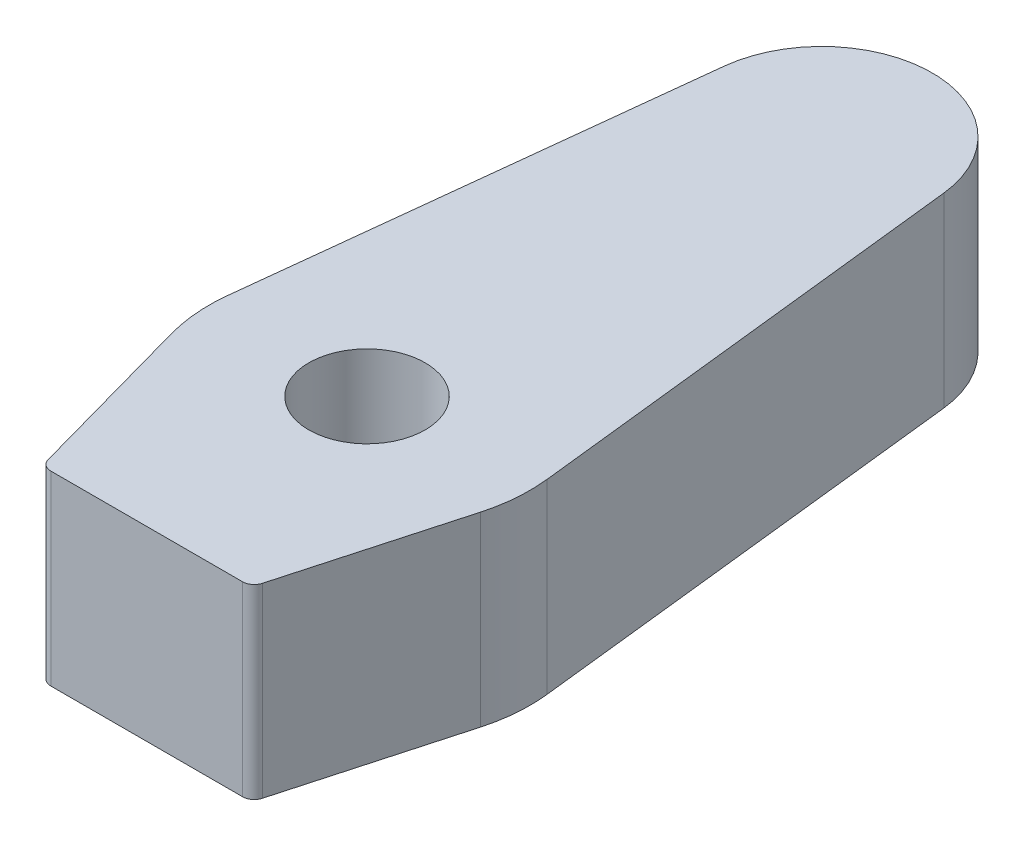
ISO-10303-21;
HEADER;
FILE_DESCRIPTION(('STEP AP214'),'2;1');
FILE_NAME('part.step','',(''),(''),'','','');
FILE_SCHEMA(('AUTOMOTIVE_DESIGN { 1 0 10303 214 1 1 1 1 }'));
ENDSEC;
DATA;
#1=APPLICATION_CONTEXT('core data for automotive mechanical design processes');
#2=APPLICATION_PROTOCOL_DEFINITION('international standard','automotive_design',2000,#1);
#3=PRODUCT_CONTEXT('',#1,'mechanical');
#4=PRODUCT('Part','Part','',(#3));
#5=PRODUCT_RELATED_PRODUCT_CATEGORY('part','',(#4));
#6=PRODUCT_DEFINITION_FORMATION('','',#4);
#7=PRODUCT_DEFINITION_CONTEXT('part definition',#1,'design');
#8=PRODUCT_DEFINITION('design','',#6,#7);
#9=PRODUCT_DEFINITION_SHAPE('','',#8);
#10=(LENGTH_UNIT() NAMED_UNIT(*) SI_UNIT(.MILLI.,.METRE.));
#11=(NAMED_UNIT(*) PLANE_ANGLE_UNIT() SI_UNIT($,.RADIAN.));
#12=(NAMED_UNIT(*) SI_UNIT($,.STERADIAN.) SOLID_ANGLE_UNIT());
#13=UNCERTAINTY_MEASURE_WITH_UNIT(LENGTH_MEASURE(1.E-05),#10,'distance_accuracy_value','');
#14=(GEOMETRIC_REPRESENTATION_CONTEXT(3) GLOBAL_UNCERTAINTY_ASSIGNED_CONTEXT((#13)) GLOBAL_UNIT_ASSIGNED_CONTEXT((#10,
#11,#12)) REPRESENTATION_CONTEXT('',''));
#15=CARTESIAN_POINT('',(0.,0.,0.));
#16=DIRECTION('',(0.,0.,1.));
#17=DIRECTION('',(1.,0.,0.));
#18=AXIS2_PLACEMENT_3D('',#15,#16,#17);
#19=CARTESIAN_POINT('',(0.,8.,-14.5));
#20=DIRECTION('',(0.,-1.,0.));
#21=DIRECTION('',(0.,0.,-1.));
#22=AXIS2_PLACEMENT_3D('',#19,#20,#21);
#23=CYLINDRICAL_SURFACE('',#22,4.75);
#24=CARTESIAN_POINT('',(0.,0.,-14.5));
#25=DIRECTION('',(0.,1.,0.));
#26=DIRECTION('',(0.,0.,1.));
#27=AXIS2_PLACEMENT_3D('',#24,#25,#26);
#28=CIRCLE('',#27,4.75);
#29=CARTESIAN_POINT('',(4.72098441721273,0.,-15.0242195460245));
#30=VERTEX_POINT('',#29);
#31=CARTESIAN_POINT('',(-4.72098441721284,0.,-15.0242195460245));
#32=VERTEX_POINT('',#31);
#33=EDGE_CURVE('E142',#30,#32,#28,.T.);
#34=ORIENTED_EDGE('',*,*,#33,.T.);
#35=DIRECTION('',(0.,-1.,0.));
#36=VECTOR('',#35,1.);
#37=CARTESIAN_POINT('',(-4.72098441721284,8.,-15.0242195460245));
#38=LINE('',#37,#36);
#39=CARTESIAN_POINT('',(-4.72098441721284,8.,-15.0242195460245));
#40=VERTEX_POINT('',#39);
#41=EDGE_CURVE('E11',#40,#32,#38,.T.);
#42=ORIENTED_EDGE('',*,*,#41,.F.);
#43=CARTESIAN_POINT('',(0.,8.,-14.5));
#44=DIRECTION('',(0.,1.,0.));
#45=DIRECTION('',(0.,0.,1.));
#46=AXIS2_PLACEMENT_3D('',#43,#44,#45);
#47=CIRCLE('',#46,4.75);
#48=CARTESIAN_POINT('',(4.72098441721273,8.,-15.0242195460245));
#49=VERTEX_POINT('',#48);
#50=EDGE_CURVE('E166',#49,#40,#47,.T.);
#51=ORIENTED_EDGE('',*,*,#50,.F.);
#52=DIRECTION('',(0.,-1.,0.));
#53=VECTOR('',#52,1.);
#54=CARTESIAN_POINT('',(4.72098441721273,8.,-15.0242195460245));
#55=LINE('',#54,#53);
#56=EDGE_CURVE('E49',#49,#30,#55,.T.);
#57=ORIENTED_EDGE('',*,*,#56,.T.);
#58=EDGE_LOOP('',(#34,#42,#51,#57));
#59=FACE_BOUND('',#58,.T.);
#60=ADVANCED_FACE('F33',(#59),#23,.T.);
#61=CARTESIAN_POINT('',(-4.72098441721284,8.,-15.0242195460245));
#62=DIRECTION('',(0.993891456255323,0.,0.110362009689359));
#63=DIRECTION('',(0.110362009689359,0.,-0.993891456255323));
#64=AXIS2_PLACEMENT_3D('',#61,#62,#63);
#65=PLANE('',#64);
#66=DIRECTION('',(-0.110362009689359,0.,0.993891456255323));
#67=VECTOR('',#66,1.);
#68=CARTESIAN_POINT('',(-4.72098441721284,0.,-15.0242195460245));
#69=LINE('',#68,#67);
#70=CARTESIAN_POINT('',(-6.85081178204851,0.,4.15644984525669));
#71=VERTEX_POINT('',#70);
#72=EDGE_CURVE('E144',#32,#71,#69,.T.);
#73=ORIENTED_EDGE('',*,*,#72,.T.);
#74=DIRECTION('',(0.,-1.,0.));
#75=VECTOR('',#74,1.);
#76=CARTESIAN_POINT('',(-6.85081178204851,8.,4.15644984525669));
#77=LINE('',#76,#75);
#78=CARTESIAN_POINT('',(-6.85081178204851,8.,4.15644984525669));
#79=VERTEX_POINT('',#78);
#80=EDGE_CURVE('E41',#79,#71,#77,.T.);
#81=ORIENTED_EDGE('',*,*,#80,.F.);
#82=DIRECTION('',(-0.110362009689359,0.,0.993891456255323));
#83=VECTOR('',#82,1.);
#84=CARTESIAN_POINT('',(-4.72098441721284,8.,-15.0242195460245));
#85=LINE('',#84,#83);
#86=EDGE_CURVE('E94',#40,#79,#85,.T.);
#87=ORIENTED_EDGE('',*,*,#86,.F.);
#88=ORIENTED_EDGE('',*,*,#41,.T.);
#89=EDGE_LOOP('',(#73,#81,#87,#88));
#90=FACE_BOUND('',#89,.T.);
#91=ADVANCED_FACE('F224',(#90),#65,.F.);
#92=CARTESIAN_POINT('',(0.106428411738743,8.,4.92898391308223));
#93=DIRECTION('',(0.,-1.,0.));
#94=DIRECTION('',(0.,0.,-1.));
#95=AXIS2_PLACEMENT_3D('',#92,#93,#94);
#96=CYLINDRICAL_SURFACE('',#95,7.);
#97=CARTESIAN_POINT('',(0.106428411738743,0.,4.92898391308223));
#98=DIRECTION('',(0.,1.,0.));
#99=DIRECTION('',(0.,0.,1.));
#100=AXIS2_PLACEMENT_3D('',#97,#98,#99);
#101=CIRCLE('',#100,7.);
#102=CARTESIAN_POINT('',(-6.63819695567083,0.,6.80249095958494));
#103=VERTEX_POINT('',#102);
#104=EDGE_CURVE('E147',#71,#103,#101,.T.);
#105=ORIENTED_EDGE('',*,*,#104,.T.);
#106=DIRECTION('',(0.,-1.,0.));
#107=VECTOR('',#106,1.);
#108=CARTESIAN_POINT('',(-6.63819695567083,8.,6.80249095958494));
#109=LINE('',#108,#107);
#110=CARTESIAN_POINT('',(-6.63819695567083,8.,6.80249095958494));
#111=VERTEX_POINT('',#110);
#112=EDGE_CURVE('E177',#111,#103,#109,.T.);
#113=ORIENTED_EDGE('',*,*,#112,.F.);
#114=CARTESIAN_POINT('',(0.106428411738743,8.,4.92898391308223));
#115=DIRECTION('',(0.,1.,0.));
#116=DIRECTION('',(0.,0.,1.));
#117=AXIS2_PLACEMENT_3D('',#114,#115,#116);
#118=CIRCLE('',#117,7.);
#119=EDGE_CURVE('E184',#79,#111,#118,.T.);
#120=ORIENTED_EDGE('',*,*,#119,.F.);
#121=ORIENTED_EDGE('',*,*,#80,.T.);
#122=EDGE_LOOP('',(#105,#113,#120,#121));
#123=FACE_BOUND('',#122,.T.);
#124=ADVANCED_FACE('F182',(#123),#96,.T.);
#125=CARTESIAN_POINT('',(-4.60171613002966,8.,14.133821931893));
#126=DIRECTION('',(-0.96351790962994,0.,0.267643863786098));
#127=DIRECTION('',(0.267643863786098,0.,0.96351790962994));
#128=AXIS2_PLACEMENT_3D('',#125,#126,#127);
#129=PLANE('',#128);
#130=DIRECTION('',(-0.267643863786098,0.,-0.96351790962994));
#131=VECTOR('',#130,1.);
#132=CARTESIAN_POINT('',(-4.60171613002966,0.,14.133821931893));
#133=LINE('',#132,#131);
#134=CARTESIAN_POINT('',(-4.60171613002966,0.,14.133821931893));
#135=VERTEX_POINT('',#134);
#136=EDGE_CURVE('E150',#135,#103,#133,.T.);
#137=ORIENTED_EDGE('',*,*,#136,.F.);
#138=DIRECTION('',(0.,-1.,0.));
#139=VECTOR('',#138,1.);
#140=CARTESIAN_POINT('',(-4.60171613002966,8.,14.133821931893));
#141=LINE('',#140,#139);
#142=CARTESIAN_POINT('',(-4.60171613002966,8.,14.133821931893));
#143=VERTEX_POINT('',#142);
#144=EDGE_CURVE('E175',#143,#135,#141,.T.);
#145=ORIENTED_EDGE('',*,*,#144,.F.);
#146=DIRECTION('',(-0.267643863786098,0.,-0.96351790962994));
#147=VECTOR('',#146,1.);
#148=CARTESIAN_POINT('',(-4.60171613002966,8.,14.133821931893));
#149=LINE('',#148,#147);
#150=EDGE_CURVE('E194',#143,#111,#149,.T.);
#151=ORIENTED_EDGE('',*,*,#150,.T.);
#152=ORIENTED_EDGE('',*,*,#112,.T.);
#153=EDGE_LOOP('',(#137,#145,#151,#152));
#154=FACE_BOUND('',#153,.T.);
#155=ADVANCED_FACE('F191',(#154),#129,.T.);
#156=CARTESIAN_POINT('',(-4.11995717521469,8.,14.));
#157=DIRECTION('',(0.,-1.,0.));
#158=DIRECTION('',(0.,0.,-1.));
#159=AXIS2_PLACEMENT_3D('',#156,#157,#158);
#160=CYLINDRICAL_SURFACE('',#159,0.5);
#161=CARTESIAN_POINT('',(-4.11995717521469,0.,14.));
#162=DIRECTION('',(0.,-1.,0.));
#163=DIRECTION('',(0.,0.,-1.));
#164=AXIS2_PLACEMENT_3D('',#161,#162,#163);
#165=CIRCLE('',#164,0.5);
#166=CARTESIAN_POINT('',(-4.11995717521469,0.,14.5));
#167=VERTEX_POINT('',#166);
#168=EDGE_CURVE('E153',#167,#135,#165,.T.);
#169=ORIENTED_EDGE('',*,*,#168,.F.);
#170=DIRECTION('',(0.,-1.,0.));
#171=VECTOR('',#170,1.);
#172=CARTESIAN_POINT('',(-4.11995717521469,8.,14.5));
#173=LINE('',#172,#171);
#174=CARTESIAN_POINT('',(-4.11995717521469,8.,14.5));
#175=VERTEX_POINT('',#174);
#176=EDGE_CURVE('E173',#175,#167,#173,.T.);
#177=ORIENTED_EDGE('',*,*,#176,.F.);
#178=CARTESIAN_POINT('',(-4.11995717521469,8.,14.));
#179=DIRECTION('',(0.,-1.,0.));
#180=DIRECTION('',(0.,0.,-1.));
#181=AXIS2_PLACEMENT_3D('',#178,#179,#180);
#182=CIRCLE('',#181,0.5);
#183=EDGE_CURVE('E197',#175,#143,#182,.T.);
#184=ORIENTED_EDGE('',*,*,#183,.T.);
#185=ORIENTED_EDGE('',*,*,#144,.T.);
#186=EDGE_LOOP('',(#169,#177,#184,#185));
#187=FACE_BOUND('',#186,.T.);
#188=ADVANCED_FACE('F299',(#187),#160,.T.);
#189=CARTESIAN_POINT('',(-4.11995717521469,8.,14.5));
#190=DIRECTION('',(0.,0.,-1.));
#191=DIRECTION('',(-1.,0.,0.));
#192=AXIS2_PLACEMENT_3D('',#189,#190,#191);
#193=PLANE('',#192);
#194=DIRECTION('',(1.,0.,0.));
#195=VECTOR('',#194,1.);
#196=CARTESIAN_POINT('',(-4.11995717521469,0.,14.5));
#197=LINE('',#196,#195);
#198=CARTESIAN_POINT('',(4.11995717521478,0.,14.5));
#199=VERTEX_POINT('',#198);
#200=EDGE_CURVE('E156',#167,#199,#197,.T.);
#201=ORIENTED_EDGE('',*,*,#200,.T.);
#202=DIRECTION('',(0.,-1.,0.));
#203=VECTOR('',#202,1.);
#204=CARTESIAN_POINT('',(4.11995717521478,8.,14.5));
#205=LINE('',#204,#203);
#206=CARTESIAN_POINT('',(4.11995717521478,8.,14.5));
#207=VERTEX_POINT('',#206);
#208=EDGE_CURVE('E170',#207,#199,#205,.T.);
#209=ORIENTED_EDGE('',*,*,#208,.F.);
#210=DIRECTION('',(1.,0.,0.));
#211=VECTOR('',#210,1.);
#212=CARTESIAN_POINT('',(-4.11995717521469,8.,14.5));
#213=LINE('',#212,#211);
#214=EDGE_CURVE('E199',#175,#207,#213,.T.);
#215=ORIENTED_EDGE('',*,*,#214,.F.);
#216=ORIENTED_EDGE('',*,*,#176,.T.);
#217=EDGE_LOOP('',(#201,#209,#215,#216));
#218=FACE_BOUND('',#217,.T.);
#219=ADVANCED_FACE('F207',(#218),#193,.F.);
#220=CARTESIAN_POINT('',(4.11995717521479,8.,14.));
#221=DIRECTION('',(0.,-1.,0.));
#222=DIRECTION('',(0.,0.,-1.));
#223=AXIS2_PLACEMENT_3D('',#220,#221,#222);
#224=CYLINDRICAL_SURFACE('',#223,0.5);
#225=CARTESIAN_POINT('',(4.11995717521479,0.,14.));
#226=DIRECTION('',(0.,1.,0.));
#227=DIRECTION('',(0.,0.,1.));
#228=AXIS2_PLACEMENT_3D('',#225,#226,#227);
#229=CIRCLE('',#228,0.5);
#230=CARTESIAN_POINT('',(4.60171613002976,0.,14.133821931893));
#231=VERTEX_POINT('',#230);
#232=EDGE_CURVE('E158',#199,#231,#229,.T.);
#233=ORIENTED_EDGE('',*,*,#232,.T.);
#234=DIRECTION('',(0.,-1.,0.));
#235=VECTOR('',#234,1.);
#236=CARTESIAN_POINT('',(4.60171613002976,8.,14.133821931893));
#237=LINE('',#236,#235);
#238=CARTESIAN_POINT('',(4.60171613002976,8.,14.133821931893));
#239=VERTEX_POINT('',#238);
#240=EDGE_CURVE('E134',#239,#231,#237,.T.);
#241=ORIENTED_EDGE('',*,*,#240,.F.);
#242=CARTESIAN_POINT('',(4.11995717521479,8.,14.));
#243=DIRECTION('',(0.,1.,0.));
#244=DIRECTION('',(0.,0.,1.));
#245=AXIS2_PLACEMENT_3D('',#242,#243,#244);
#246=CIRCLE('',#245,0.5);
#247=EDGE_CURVE('E122',#207,#239,#246,.T.);
#248=ORIENTED_EDGE('',*,*,#247,.F.);
#249=ORIENTED_EDGE('',*,*,#208,.T.);
#250=EDGE_LOOP('',(#233,#241,#248,#249));
#251=FACE_BOUND('',#250,.T.);
#252=ADVANCED_FACE('F210',(#251),#224,.T.);
#253=CARTESIAN_POINT('',(4.60171613002976,8.,14.133821931893));
#254=DIRECTION('',(-0.963517909629941,0.,-0.267643863786092));
#255=DIRECTION('',(-0.267643863786092,0.,0.963517909629942));
#256=AXIS2_PLACEMENT_3D('',#253,#254,#255);
#257=PLANE('',#256);
#258=DIRECTION('',(0.267643863786092,0.,-0.963517909629942));
#259=VECTOR('',#258,1.);
#260=CARTESIAN_POINT('',(4.60171613002976,0.,14.133821931893));
#261=LINE('',#260,#259);
#262=CARTESIAN_POINT('',(6.63819695567087,0.,6.80249095958494));
#263=VERTEX_POINT('',#262);
#264=EDGE_CURVE('E131',#231,#263,#261,.T.);
#265=ORIENTED_EDGE('',*,*,#264,.T.);
#266=DIRECTION('',(0.,-1.,0.));
#267=VECTOR('',#266,1.);
#268=CARTESIAN_POINT('',(6.63819695567087,8.,6.80249095958494));
#269=LINE('',#268,#267);
#270=CARTESIAN_POINT('',(6.63819695567087,8.,6.80249095958494));
#271=VERTEX_POINT('',#270);
#272=EDGE_CURVE('E128',#271,#263,#269,.T.);
#273=ORIENTED_EDGE('',*,*,#272,.F.);
#274=DIRECTION('',(0.267643863786092,0.,-0.963517909629942));
#275=VECTOR('',#274,1.);
#276=CARTESIAN_POINT('',(4.60171613002976,8.,14.133821931893));
#277=LINE('',#276,#275);
#278=EDGE_CURVE('E115',#239,#271,#277,.T.);
#279=ORIENTED_EDGE('',*,*,#278,.F.);
#280=ORIENTED_EDGE('',*,*,#240,.T.);
#281=EDGE_LOOP('',(#265,#273,#279,#280));
#282=FACE_BOUND('',#281,.T.);
#283=ADVANCED_FACE('F129',(#282),#257,.F.);
#284=CARTESIAN_POINT('',(-0.106428411738709,8.,4.92898391308228));
#285=DIRECTION('',(0.,-1.,0.));
#286=DIRECTION('',(0.,0.,-1.));
#287=AXIS2_PLACEMENT_3D('',#284,#285,#286);
#288=CYLINDRICAL_SURFACE('',#287,7.);
#289=CARTESIAN_POINT('',(-0.106428411738709,0.,4.92898391308228));
#290=DIRECTION('',(0.,1.,0.));
#291=DIRECTION('',(0.,0.,1.));
#292=AXIS2_PLACEMENT_3D('',#289,#290,#291);
#293=CIRCLE('',#292,7.);
#294=CARTESIAN_POINT('',(6.85081178204854,0.,4.15644984525669));
#295=VERTEX_POINT('',#294);
#296=EDGE_CURVE('E161',#263,#295,#293,.T.);
#297=ORIENTED_EDGE('',*,*,#296,.T.);
#298=DIRECTION('',(0.,-1.,0.));
#299=VECTOR('',#298,1.);
#300=CARTESIAN_POINT('',(6.85081178204854,8.,4.15644984525669));
#301=LINE('',#300,#299);
#302=CARTESIAN_POINT('',(6.85081178204854,8.,4.15644984525669));
#303=VERTEX_POINT('',#302);
#304=EDGE_CURVE('E82',#303,#295,#301,.T.);
#305=ORIENTED_EDGE('',*,*,#304,.F.);
#306=CARTESIAN_POINT('',(-0.106428411738709,8.,4.92898391308228));
#307=DIRECTION('',(0.,1.,0.));
#308=DIRECTION('',(0.,0.,1.));
#309=AXIS2_PLACEMENT_3D('',#306,#307,#308);
#310=CIRCLE('',#309,7.);
#311=EDGE_CURVE('E120',#271,#303,#310,.T.);
#312=ORIENTED_EDGE('',*,*,#311,.F.);
#313=ORIENTED_EDGE('',*,*,#272,.T.);
#314=EDGE_LOOP('',(#297,#305,#312,#313));
#315=FACE_BOUND('',#314,.T.);
#316=ADVANCED_FACE('F136',(#315),#288,.T.);
#317=CARTESIAN_POINT('',(4.72098441721273,8.,-15.0242195460245));
#318=DIRECTION('',(0.993891456255322,0.,-0.110362009689366));
#319=DIRECTION('',(-0.110362009689366,0.,-0.993891456255322));
#320=AXIS2_PLACEMENT_3D('',#317,#318,#319);
#321=PLANE('',#320);
#322=DIRECTION('',(0.110362009689366,0.,0.993891456255322));
#323=VECTOR('',#322,1.);
#324=CARTESIAN_POINT('',(4.72098441721273,0.,-15.0242195460245));
#325=LINE('',#324,#323);
#326=EDGE_CURVE('E163',#30,#295,#325,.T.);
#327=ORIENTED_EDGE('',*,*,#326,.F.);
#328=ORIENTED_EDGE('',*,*,#56,.F.);
#329=DIRECTION('',(0.110362009689366,0.,0.993891456255322));
#330=VECTOR('',#329,1.);
#331=CARTESIAN_POINT('',(4.72098441721273,8.,-15.0242195460245));
#332=LINE('',#331,#330);
#333=EDGE_CURVE('E137',#49,#303,#332,.T.);
#334=ORIENTED_EDGE('',*,*,#333,.T.);
#335=ORIENTED_EDGE('',*,*,#304,.T.);
#336=EDGE_LOOP('',(#327,#328,#334,#335));
#337=FACE_BOUND('',#336,.T.);
#338=ADVANCED_FACE('F211',(#337),#321,.T.);
#339=CARTESIAN_POINT('',(0.,8.,-14.5));
#340=DIRECTION('',(0.,1.,0.));
#341=DIRECTION('',(0.,0.,1.));
#342=AXIS2_PLACEMENT_3D('',#339,#340,#341);
#343=PLANE('',#342);
#344=CARTESIAN_POINT('',(-0.106428411738709,8.,4.92898391308228));
#345=DIRECTION('',(0.,1.,0.));
#346=DIRECTION('',(0.,0.,1.));
#347=AXIS2_PLACEMENT_3D('',#344,#345,#346);
#348=CIRCLE('',#347,2.5);
#349=CARTESIAN_POINT('',(-0.106428411738709,8.,7.42898391308228));
#350=VERTEX_POINT('',#349);
#351=EDGE_CURVE('E231',#350,#350,#348,.T.);
#352=ORIENTED_EDGE('',*,*,#351,.F.);
#353=EDGE_LOOP('',(#352));
#354=FACE_BOUND('',#353,.T.);
#355=ORIENTED_EDGE('',*,*,#50,.T.);
#356=ORIENTED_EDGE('',*,*,#86,.T.);
#357=ORIENTED_EDGE('',*,*,#119,.T.);
#358=ORIENTED_EDGE('',*,*,#150,.F.);
#359=ORIENTED_EDGE('',*,*,#183,.F.);
#360=ORIENTED_EDGE('',*,*,#214,.T.);
#361=ORIENTED_EDGE('',*,*,#247,.T.);
#362=ORIENTED_EDGE('',*,*,#278,.T.);
#363=ORIENTED_EDGE('',*,*,#311,.T.);
#364=ORIENTED_EDGE('',*,*,#333,.F.);
#365=EDGE_LOOP('',(#355,#356,#357,#358,#359,#360,#361,#362,#363,#364));
#366=FACE_BOUND('',#365,.T.);
#367=ADVANCED_FACE('F117',(#354,#366),#343,.T.);
#368=CARTESIAN_POINT('',(0.,0.,-14.5));
#369=DIRECTION('',(0.,1.,0.));
#370=DIRECTION('',(0.,0.,1.));
#371=AXIS2_PLACEMENT_3D('',#368,#369,#370);
#372=PLANE('',#371);
#373=ORIENTED_EDGE('',*,*,#33,.F.);
#374=ORIENTED_EDGE('',*,*,#326,.T.);
#375=ORIENTED_EDGE('',*,*,#296,.F.);
#376=ORIENTED_EDGE('',*,*,#264,.F.);
#377=ORIENTED_EDGE('',*,*,#232,.F.);
#378=ORIENTED_EDGE('',*,*,#200,.F.);
#379=ORIENTED_EDGE('',*,*,#168,.T.);
#380=ORIENTED_EDGE('',*,*,#136,.T.);
#381=ORIENTED_EDGE('',*,*,#104,.F.);
#382=ORIENTED_EDGE('',*,*,#72,.F.);
#383=EDGE_LOOP('',(#373,#374,#375,#376,#377,#378,#379,#380,#381,#382));
#384=FACE_BOUND('',#383,.T.);
#385=ADVANCED_FACE('F186',(#384),#372,.F.);
#386=CARTESIAN_POINT('',(-0.106428411738709,2.85,4.92898391308228));
#387=DIRECTION('',(0.,1.,0.));
#388=DIRECTION('',(0.,0.,1.));
#389=AXIS2_PLACEMENT_3D('',#386,#387,#388);
#390=CYLINDRICAL_SURFACE('',#389,2.5);
#391=CARTESIAN_POINT('',(-0.106428411738709,2.85,4.92898391308228));
#392=DIRECTION('',(0.,1.,0.));
#393=DIRECTION('',(0.,0.,1.));
#394=AXIS2_PLACEMENT_3D('',#391,#392,#393);
#395=CIRCLE('',#394,2.5);
#396=CARTESIAN_POINT('',(-0.106428411738709,2.85,7.42898391308228));
#397=VERTEX_POINT('',#396);
#398=EDGE_CURVE('E145',#397,#397,#395,.T.);
#399=CARTESIAN_POINT('',(-0.106428411738709,2.85,7.42898391308228));
#400=CARTESIAN_POINT('',(-0.106428411738709,2.90364583333333,7.42898391308228));
#401=CARTESIAN_POINT('',(-0.106428411738709,2.95729166666667,7.42898391308228));
#402=CARTESIAN_POINT('',(-0.106428411738709,3.06458333333333,7.42898391308228));
#403=CARTESIAN_POINT('',(-0.106428411738709,3.11822916666667,7.42898391308228));
#404=CARTESIAN_POINT('',(-0.106428411738709,3.22552083333333,7.42898391308228));
#405=CARTESIAN_POINT('',(-0.106428411738709,3.27916666666667,7.42898391308228));
#406=CARTESIAN_POINT('',(-0.106428411738709,3.38645833333333,7.42898391308228));
#407=CARTESIAN_POINT('',(-0.106428411738709,3.44010416666667,7.42898391308228));
#408=CARTESIAN_POINT('',(-0.106428411738709,3.54739583333333,7.42898391308228));
#409=CARTESIAN_POINT('',(-0.106428411738709,3.60104166666667,7.42898391308228));
#410=CARTESIAN_POINT('',(-0.106428411738709,3.70833333333333,7.42898391308228));
#411=CARTESIAN_POINT('',(-0.106428411738709,3.76197916666667,7.42898391308228));
#412=CARTESIAN_POINT('',(-0.106428411738709,3.86927083333333,7.42898391308228));
#413=CARTESIAN_POINT('',(-0.106428411738709,3.92291666666667,7.42898391308228));
#414=CARTESIAN_POINT('',(-0.106428411738709,4.03020833333333,7.42898391308228));
#415=CARTESIAN_POINT('',(-0.106428411738709,4.08385416666667,7.42898391308228));
#416=CARTESIAN_POINT('',(-0.106428411738709,4.19114583333333,7.42898391308228));
#417=CARTESIAN_POINT('',(-0.106428411738709,4.24479166666667,7.42898391308228));
#418=CARTESIAN_POINT('',(-0.106428411738709,4.35208333333333,7.42898391308228));
#419=CARTESIAN_POINT('',(-0.106428411738709,4.40572916666667,7.42898391308228));
#420=CARTESIAN_POINT('',(-0.106428411738709,4.51302083333333,7.42898391308228));
#421=CARTESIAN_POINT('',(-0.106428411738709,4.56666666666667,7.42898391308228));
#422=CARTESIAN_POINT('',(-0.106428411738709,4.67395833333333,7.42898391308228));
#423=CARTESIAN_POINT('',(-0.106428411738709,4.72760416666667,7.42898391308228));
#424=CARTESIAN_POINT('',(-0.106428411738709,4.83489583333333,7.42898391308228));
#425=CARTESIAN_POINT('',(-0.106428411738709,4.88854166666667,7.42898391308228));
#426=CARTESIAN_POINT('',(-0.106428411738709,4.99583333333333,7.42898391308228));
#427=CARTESIAN_POINT('',(-0.106428411738709,5.04947916666667,7.42898391308228));
#428=CARTESIAN_POINT('',(-0.106428411738709,5.15677083333333,7.42898391308228));
#429=CARTESIAN_POINT('',(-0.106428411738709,5.21041666666667,7.42898391308228));
#430=CARTESIAN_POINT('',(-0.106428411738709,5.31770833333333,7.42898391308228));
#431=CARTESIAN_POINT('',(-0.106428411738709,5.37135416666667,7.42898391308228));
#432=CARTESIAN_POINT('',(-0.106428411738709,5.47864583333333,7.42898391308228));
#433=CARTESIAN_POINT('',(-0.106428411738709,5.53229166666667,7.42898391308228));
#434=CARTESIAN_POINT('',(-0.106428411738709,5.63958333333333,7.42898391308228));
#435=CARTESIAN_POINT('',(-0.106428411738709,5.69322916666667,7.42898391308228));
#436=CARTESIAN_POINT('',(-0.106428411738709,5.80052083333333,7.42898391308228));
#437=CARTESIAN_POINT('',(-0.106428411738709,5.85416666666667,7.42898391308228));
#438=CARTESIAN_POINT('',(-0.106428411738709,5.96145833333333,7.42898391308228));
#439=CARTESIAN_POINT('',(-0.106428411738709,6.01510416666667,7.42898391308228));
#440=CARTESIAN_POINT('',(-0.106428411738709,6.12239583333333,7.42898391308228));
#441=CARTESIAN_POINT('',(-0.106428411738709,6.17604166666667,7.42898391308228));
#442=CARTESIAN_POINT('',(-0.106428411738709,6.28333333333333,7.42898391308228));
#443=CARTESIAN_POINT('',(-0.106428411738709,6.33697916666666,7.42898391308228));
#444=CARTESIAN_POINT('',(-0.106428411738709,6.44427083333333,7.42898391308228));
#445=CARTESIAN_POINT('',(-0.106428411738709,6.49791666666667,7.42898391308228));
#446=CARTESIAN_POINT('',(-0.106428411738709,6.60520833333333,7.42898391308228));
#447=CARTESIAN_POINT('',(-0.106428411738709,6.65885416666667,7.42898391308228));
#448=CARTESIAN_POINT('',(-0.106428411738709,6.76614583333333,7.42898391308228));
#449=CARTESIAN_POINT('',(-0.106428411738709,6.81979166666667,7.42898391308228));
#450=CARTESIAN_POINT('',(-0.106428411738709,6.92708333333333,7.42898391308228));
#451=CARTESIAN_POINT('',(-0.106428411738709,6.98072916666667,7.42898391308228));
#452=CARTESIAN_POINT('',(-0.106428411738709,7.08802083333333,7.42898391308228));
#453=CARTESIAN_POINT('',(-0.106428411738709,7.14166666666667,7.42898391308228));
#454=CARTESIAN_POINT('',(-0.106428411738709,7.24895833333333,7.42898391308228));
#455=CARTESIAN_POINT('',(-0.106428411738709,7.30260416666667,7.42898391308228));
#456=CARTESIAN_POINT('',(-0.106428411738709,7.40989583333333,7.42898391308228));
#457=CARTESIAN_POINT('',(-0.106428411738709,7.46354166666667,7.42898391308228));
#458=CARTESIAN_POINT('',(-0.106428411738709,7.57083333333333,7.42898391308228));
#459=CARTESIAN_POINT('',(-0.106428411738709,7.62447916666667,7.42898391308228));
#460=CARTESIAN_POINT('',(-0.106428411738709,7.73177083333333,7.42898391308228));
#461=CARTESIAN_POINT('',(-0.106428411738709,7.78541666666667,7.42898391308228));
#462=CARTESIAN_POINT('',(-0.106428411738709,7.89270833333333,7.42898391308228));
#463=CARTESIAN_POINT('',(-0.106428411738709,7.94635416666667,7.42898391308228));
#464=CARTESIAN_POINT('',(-0.106428411738709,8.,7.42898391308228));
#465=B_SPLINE_CURVE_WITH_KNOTS('',3,(#399,#400,#401,#402,#403,#404,#405,#406,#407,#408,#409,
#410,#411,#412,#413,#414,#415,#416,#417,#418,#419,#420,#421,#422,#423,#424,#425,#426,#427,#428,
#429,#430,#431,#432,#433,#434,#435,#436,#437,#438,#439,#440,#441,#442,#443,#444,#445,#446,#447,
#448,#449,#450,#451,#452,#453,#454,#455,#456,#457,#458,#459,#460,#461,#462,#463,#464),
.UNSPECIFIED.,.F.,.F.,(4,2,2,2,2,2,2,2,2,2,2,2,2,2,2,2,2,2,2,2,2,2,2,2,2,2,2,2,2,2,2,2,4),(0.,
0.1609375,0.321875,0.4828125,0.64375,0.8046875,0.965625,1.1265625,1.2875,1.4484375,1.609375,
1.7703125,1.93125,2.0921875,2.253125,2.4140625,2.575,2.7359375,2.896875,3.0578125,3.21875,
3.3796875,3.540625,3.7015625,3.8625,4.0234375,4.184375,4.3453125,4.50625,4.6671875,4.828125,
4.9890625,5.15),.UNSPECIFIED.);
#466=EDGE_CURVE('BSEAM239',#397,#350,#465,.T.);
#467=ORIENTED_EDGE('',*,*,#398,.F.);
#468=ORIENTED_EDGE('',*,*,#351,.T.);
#469=ORIENTED_EDGE('',*,*,#466,.T.);
#470=ORIENTED_EDGE('',*,*,#466,.F.);
#471=EDGE_LOOP('',(#467,#469,#468,#470));
#472=FACE_BOUND('',#471,.T.);
#473=ADVANCED_FACE('F239',(#472),#390,.F.);
#474=CARTESIAN_POINT('',(-0.106428411738709,2.85,4.92898391308228));
#475=DIRECTION('',(0.,1.,0.));
#476=DIRECTION('',(0.,0.,1.));
#477=AXIS2_PLACEMENT_3D('',#474,#475,#476);
#478=PLANE('',#477);
#479=ORIENTED_EDGE('',*,*,#398,.T.);
#480=EDGE_LOOP('',(#479));
#481=FACE_BOUND('',#480,.T.);
#482=ADVANCED_FACE('F237',(#481),#478,.T.);
#483=CLOSED_SHELL('',(#60,#91,#124,#155,#188,#219,#252,#283,#316,#338,#367,#385,#473,#482));
#484=MANIFOLD_SOLID_BREP('B2',#483);
#485=ADVANCED_BREP_SHAPE_REPRESENTATION('',(#18,#484),#14);
#486=SHAPE_DEFINITION_REPRESENTATION(#9,#485);
ENDSEC;
END-ISO-10303-21;
